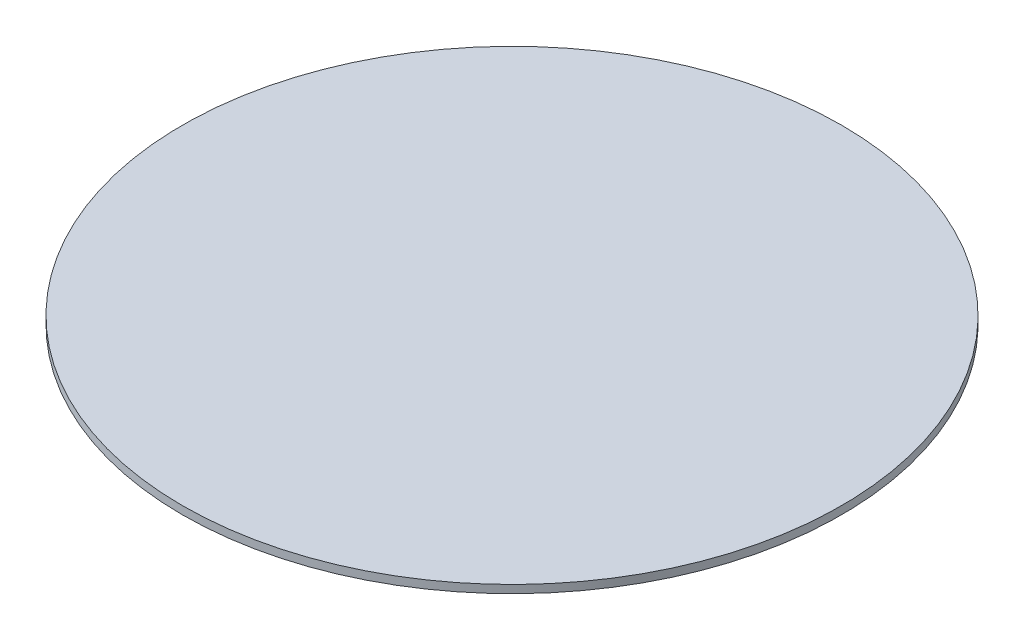
ISO-10303-21;
HEADER;
FILE_DESCRIPTION(('STEP AP214'),'2;1');
FILE_NAME('part.step','',(''),(''),'','','');
FILE_SCHEMA(('AUTOMOTIVE_DESIGN { 1 0 10303 214 1 1 1 1 }'));
ENDSEC;
DATA;
#1=APPLICATION_CONTEXT('core data for automotive mechanical design processes');
#2=APPLICATION_PROTOCOL_DEFINITION('international standard','automotive_design',2000,#1);
#3=PRODUCT_CONTEXT('',#1,'mechanical');
#4=PRODUCT('Part','Part','',(#3));
#5=PRODUCT_RELATED_PRODUCT_CATEGORY('part','',(#4));
#6=PRODUCT_DEFINITION_FORMATION('','',#4);
#7=PRODUCT_DEFINITION_CONTEXT('part definition',#1,'design');
#8=PRODUCT_DEFINITION('design','',#6,#7);
#9=PRODUCT_DEFINITION_SHAPE('','',#8);
#10=(LENGTH_UNIT() NAMED_UNIT(*) SI_UNIT(.MILLI.,.METRE.));
#11=(NAMED_UNIT(*) PLANE_ANGLE_UNIT() SI_UNIT($,.RADIAN.));
#12=(NAMED_UNIT(*) SI_UNIT($,.STERADIAN.) SOLID_ANGLE_UNIT());
#13=UNCERTAINTY_MEASURE_WITH_UNIT(LENGTH_MEASURE(1.E-05),#10,'distance_accuracy_value','');
#14=(GEOMETRIC_REPRESENTATION_CONTEXT(3) GLOBAL_UNCERTAINTY_ASSIGNED_CONTEXT((#13)) GLOBAL_UNIT_ASSIGNED_CONTEXT((#10,
#11,#12)) REPRESENTATION_CONTEXT('',''));
#15=CARTESIAN_POINT('',(0.,0.,0.));
#16=DIRECTION('',(0.,0.,1.));
#17=DIRECTION('',(1.,0.,0.));
#18=AXIS2_PLACEMENT_3D('',#15,#16,#17);
#19=CARTESIAN_POINT('',(0.,5.,0.));
#20=DIRECTION('',(0.,-1.,0.));
#21=DIRECTION('',(0.,0.,-1.));
#22=AXIS2_PLACEMENT_3D('',#19,#20,#21);
#23=CYLINDRICAL_SURFACE('',#22,206.317165824108);
#24=CARTESIAN_POINT('',(0.,5.,0.));
#25=DIRECTION('',(0.,1.,0.));
#26=DIRECTION('',(0.,0.,1.));
#27=AXIS2_PLACEMENT_3D('',#24,#25,#26);
#28=CIRCLE('',#27,206.317165824108);
#29=CARTESIAN_POINT('',(0.,5.,206.317165824108));
#30=VERTEX_POINT('',#29);
#31=EDGE_CURVE('E10',#30,#30,#28,.T.);
#32=ORIENTED_EDGE('',*,*,#31,.F.);
#33=EDGE_LOOP('',(#32));
#34=FACE_BOUND('',#33,.T.);
#35=CARTESIAN_POINT('',(0.,0.,0.));
#36=DIRECTION('',(0.,1.,0.));
#37=DIRECTION('',(0.,0.,1.));
#38=AXIS2_PLACEMENT_3D('',#35,#36,#37);
#39=CIRCLE('',#38,206.317165824108);
#40=CARTESIAN_POINT('',(0.,0.,206.317165824108));
#41=VERTEX_POINT('',#40);
#42=EDGE_CURVE('E34',#41,#41,#39,.T.);
#43=ORIENTED_EDGE('',*,*,#42,.T.);
#44=EDGE_LOOP('',(#43));
#45=FACE_BOUND('',#44,.T.);
#46=ADVANCED_FACE('F31',(#34,#45),#23,.T.);
#47=CARTESIAN_POINT('',(0.,5.,0.));
#48=DIRECTION('',(0.,1.,0.));
#49=DIRECTION('',(0.,0.,1.));
#50=AXIS2_PLACEMENT_3D('',#47,#48,#49);
#51=PLANE('',#50);
#52=ORIENTED_EDGE('',*,*,#31,.T.);
#53=EDGE_LOOP('',(#52));
#54=FACE_BOUND('',#53,.T.);
#55=ADVANCED_FACE('F46',(#54),#51,.T.);
#56=CARTESIAN_POINT('',(0.,0.,0.));
#57=DIRECTION('',(0.,1.,0.));
#58=DIRECTION('',(0.,0.,1.));
#59=AXIS2_PLACEMENT_3D('',#56,#57,#58);
#60=PLANE('',#59);
#61=ORIENTED_EDGE('',*,*,#42,.F.);
#62=EDGE_LOOP('',(#61));
#63=FACE_BOUND('',#62,.T.);
#64=ADVANCED_FACE('F44',(#63),#60,.F.);
#65=CLOSED_SHELL('',(#46,#55,#64));
#66=MANIFOLD_SOLID_BREP('B2',#65);
#67=ADVANCED_BREP_SHAPE_REPRESENTATION('',(#18,#66),#14);
#68=SHAPE_DEFINITION_REPRESENTATION(#9,#67);
ENDSEC;
END-ISO-10303-21;
